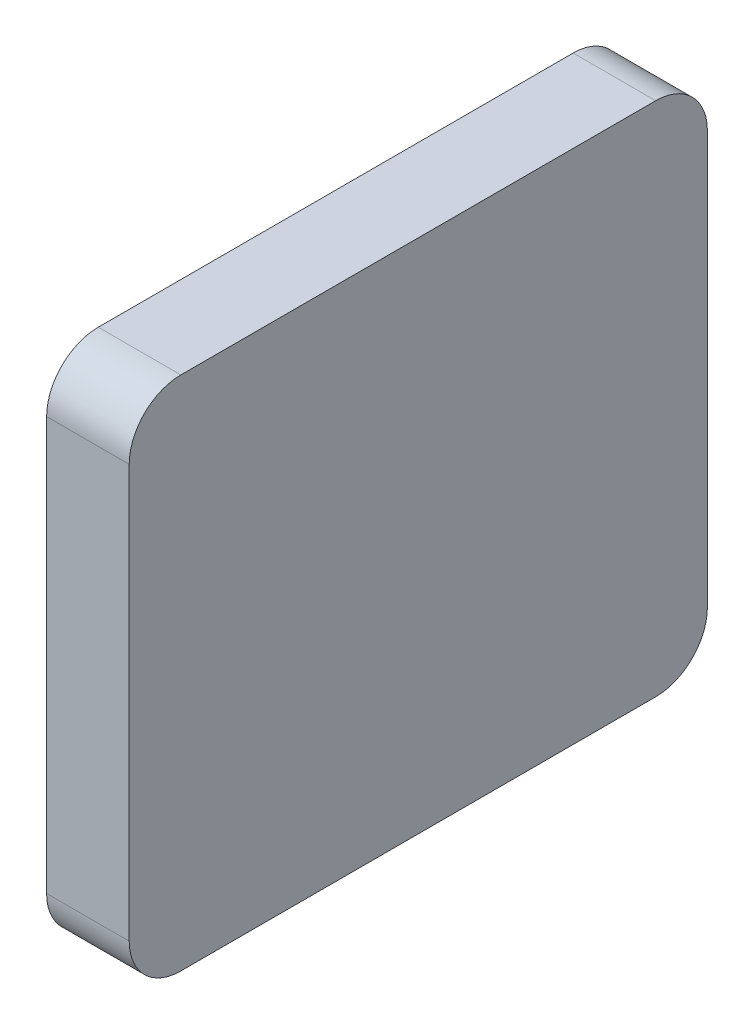
ISO-10303-21;
HEADER;
FILE_DESCRIPTION(('STEP AP214'),'2;1');
FILE_NAME('part.step','',(''),(''),'','','');
FILE_SCHEMA(('AUTOMOTIVE_DESIGN { 1 0 10303 214 1 1 1 1 }'));
ENDSEC;
DATA;
#1=APPLICATION_CONTEXT('core data for automotive mechanical design processes');
#2=APPLICATION_PROTOCOL_DEFINITION('international standard','automotive_design',2000,#1);
#3=PRODUCT_CONTEXT('',#1,'mechanical');
#4=PRODUCT('Part','Part','',(#3));
#5=PRODUCT_RELATED_PRODUCT_CATEGORY('part','',(#4));
#6=PRODUCT_DEFINITION_FORMATION('','',#4);
#7=PRODUCT_DEFINITION_CONTEXT('part definition',#1,'design');
#8=PRODUCT_DEFINITION('design','',#6,#7);
#9=PRODUCT_DEFINITION_SHAPE('','',#8);
#10=(LENGTH_UNIT() NAMED_UNIT(*) SI_UNIT(.MILLI.,.METRE.));
#11=(NAMED_UNIT(*) PLANE_ANGLE_UNIT() SI_UNIT($,.RADIAN.));
#12=(NAMED_UNIT(*) SI_UNIT($,.STERADIAN.) SOLID_ANGLE_UNIT());
#13=UNCERTAINTY_MEASURE_WITH_UNIT(LENGTH_MEASURE(1.E-05),#10,'distance_accuracy_value','');
#14=(GEOMETRIC_REPRESENTATION_CONTEXT(3) GLOBAL_UNCERTAINTY_ASSIGNED_CONTEXT((#13)) GLOBAL_UNIT_ASSIGNED_CONTEXT((#10,
#11,#12)) REPRESENTATION_CONTEXT('',''));
#15=CARTESIAN_POINT('',(0.,0.,0.));
#16=DIRECTION('',(0.,0.,1.));
#17=DIRECTION('',(1.,0.,0.));
#18=AXIS2_PLACEMENT_3D('',#15,#16,#17);
#19=CARTESIAN_POINT('',(0.4,2.5,-2.8));
#20=DIRECTION('',(0.,0.,1.));
#21=DIRECTION('',(0.,-1.,0.));
#22=AXIS2_PLACEMENT_3D('',#19,#20,#21);
#23=PLANE('',#22);
#24=DIRECTION('',(0.,1.,0.));
#25=VECTOR('',#24,1.);
#26=CARTESIAN_POINT('',(0.4,2.5,-2.8));
#27=LINE('',#26,#25);
#28=CARTESIAN_POINT('',(0.4,-2.,-2.8));
#29=VERTEX_POINT('',#28);
#30=CARTESIAN_POINT('',(0.4,2.,-2.8));
#31=VERTEX_POINT('',#30);
#32=EDGE_CURVE('E118',#29,#31,#27,.T.);
#33=ORIENTED_EDGE('',*,*,#32,.F.);
#34=DIRECTION('',(-1.,0.,0.));
#35=VECTOR('',#34,1.);
#36=CARTESIAN_POINT('',(0.4,-2.,-2.8));
#37=LINE('',#36,#35);
#38=CARTESIAN_POINT('',(-0.4,-2.,-2.8));
#39=VERTEX_POINT('',#38);
#40=EDGE_CURVE('E103',#29,#39,#37,.T.);
#41=ORIENTED_EDGE('',*,*,#40,.T.);
#42=DIRECTION('',(0.,1.,0.));
#43=VECTOR('',#42,1.);
#44=CARTESIAN_POINT('',(-0.4,2.5,-2.8));
#45=LINE('',#44,#43);
#46=CARTESIAN_POINT('',(-0.4,2.,-2.8));
#47=VERTEX_POINT('',#46);
#48=EDGE_CURVE('E115',#39,#47,#45,.T.);
#49=ORIENTED_EDGE('',*,*,#48,.T.);
#50=DIRECTION('',(-1.,0.,0.));
#51=VECTOR('',#50,1.);
#52=CARTESIAN_POINT('',(0.4,2.,-2.8));
#53=LINE('',#52,#51);
#54=EDGE_CURVE('E120',#47,#31,#53,.F.);
#55=ORIENTED_EDGE('',*,*,#54,.T.);
#56=EDGE_LOOP('',(#33,#41,#49,#55));
#57=FACE_BOUND('',#56,.T.);
#58=ADVANCED_FACE('F33',(#57),#23,.F.);
#59=CARTESIAN_POINT('',(0.4,2.5,2.8));
#60=DIRECTION('',(0.,-1.,0.));
#61=DIRECTION('',(0.,0.,-1.));
#62=AXIS2_PLACEMENT_3D('',#59,#60,#61);
#63=PLANE('',#62);
#64=DIRECTION('',(0.,0.,1.));
#65=VECTOR('',#64,1.);
#66=CARTESIAN_POINT('',(-0.4,2.5,2.8));
#67=LINE('',#66,#65);
#68=CARTESIAN_POINT('',(-0.4,2.5,-2.3));
#69=VERTEX_POINT('',#68);
#70=CARTESIAN_POINT('',(-0.4,2.5,2.3));
#71=VERTEX_POINT('',#70);
#72=EDGE_CURVE('E124',#69,#71,#67,.T.);
#73=ORIENTED_EDGE('',*,*,#72,.T.);
#74=DIRECTION('',(-1.,0.,0.));
#75=VECTOR('',#74,1.);
#76=CARTESIAN_POINT('',(0.4,2.5,2.3));
#77=LINE('',#76,#75);
#78=CARTESIAN_POINT('',(0.4,2.5,2.3));
#79=VERTEX_POINT('',#78);
#80=EDGE_CURVE('E11',#71,#79,#77,.F.);
#81=ORIENTED_EDGE('',*,*,#80,.T.);
#82=DIRECTION('',(0.,0.,1.));
#83=VECTOR('',#82,1.);
#84=CARTESIAN_POINT('',(0.4,2.5,2.8));
#85=LINE('',#84,#83);
#86=CARTESIAN_POINT('',(0.4,2.5,-2.3));
#87=VERTEX_POINT('',#86);
#88=EDGE_CURVE('E160',#87,#79,#85,.T.);
#89=ORIENTED_EDGE('',*,*,#88,.F.);
#90=DIRECTION('',(-1.,0.,0.));
#91=VECTOR('',#90,1.);
#92=CARTESIAN_POINT('',(0.4,2.5,-2.3));
#93=LINE('',#92,#91);
#94=EDGE_CURVE('E41',#87,#69,#93,.T.);
#95=ORIENTED_EDGE('',*,*,#94,.T.);
#96=EDGE_LOOP('',(#73,#81,#89,#95));
#97=FACE_BOUND('',#96,.T.);
#98=ADVANCED_FACE('F158',(#97),#63,.F.);
#99=CARTESIAN_POINT('',(0.4,2.5,2.8));
#100=DIRECTION('',(0.,0.,-1.));
#101=DIRECTION('',(0.,1.,0.));
#102=AXIS2_PLACEMENT_3D('',#99,#100,#101);
#103=PLANE('',#102);
#104=DIRECTION('',(0.,-1.,0.));
#105=VECTOR('',#104,1.);
#106=CARTESIAN_POINT('',(-0.4,2.5,2.8));
#107=LINE('',#106,#105);
#108=CARTESIAN_POINT('',(-0.4,2.,2.8));
#109=VERTEX_POINT('',#108);
#110=CARTESIAN_POINT('',(-0.4,-2.,2.8));
#111=VERTEX_POINT('',#110);
#112=EDGE_CURVE('E127',#109,#111,#107,.T.);
#113=ORIENTED_EDGE('',*,*,#112,.T.);
#114=DIRECTION('',(-1.,0.,0.));
#115=VECTOR('',#114,1.);
#116=CARTESIAN_POINT('',(0.4,-2.,2.8));
#117=LINE('',#116,#115);
#118=CARTESIAN_POINT('',(0.4,-2.,2.8));
#119=VERTEX_POINT('',#118);
#120=EDGE_CURVE('E48',#111,#119,#117,.F.);
#121=ORIENTED_EDGE('',*,*,#120,.T.);
#122=DIRECTION('',(0.,-1.,0.));
#123=VECTOR('',#122,1.);
#124=CARTESIAN_POINT('',(0.4,2.5,2.8));
#125=LINE('',#124,#123);
#126=CARTESIAN_POINT('',(0.4,2.,2.8));
#127=VERTEX_POINT('',#126);
#128=EDGE_CURVE('E168',#127,#119,#125,.T.);
#129=ORIENTED_EDGE('',*,*,#128,.F.);
#130=DIRECTION('',(-1.,0.,0.));
#131=VECTOR('',#130,1.);
#132=CARTESIAN_POINT('',(0.4,2.,2.8));
#133=LINE('',#132,#131);
#134=EDGE_CURVE('E151',#127,#109,#133,.T.);
#135=ORIENTED_EDGE('',*,*,#134,.T.);
#136=EDGE_LOOP('',(#113,#121,#129,#135));
#137=FACE_BOUND('',#136,.T.);
#138=ADVANCED_FACE('F167',(#137),#103,.F.);
#139=CARTESIAN_POINT('',(0.4,-2.5,2.8));
#140=DIRECTION('',(0.,1.,0.));
#141=DIRECTION('',(0.,0.,1.));
#142=AXIS2_PLACEMENT_3D('',#139,#140,#141);
#143=PLANE('',#142);
#144=DIRECTION('',(0.,0.,-1.));
#145=VECTOR('',#144,1.);
#146=CARTESIAN_POINT('',(-0.4,-2.5,2.8));
#147=LINE('',#146,#145);
#148=CARTESIAN_POINT('',(-0.4,-2.5,2.3));
#149=VERTEX_POINT('',#148);
#150=CARTESIAN_POINT('',(-0.4,-2.5,-2.3));
#151=VERTEX_POINT('',#150);
#152=EDGE_CURVE('E134',#149,#151,#147,.T.);
#153=ORIENTED_EDGE('',*,*,#152,.T.);
#154=DIRECTION('',(-1.,0.,0.));
#155=VECTOR('',#154,1.);
#156=CARTESIAN_POINT('',(0.4,-2.5,-2.3));
#157=LINE('',#156,#155);
#158=CARTESIAN_POINT('',(0.4,-2.5,-2.3));
#159=VERTEX_POINT('',#158);
#160=EDGE_CURVE('E104',#151,#159,#157,.F.);
#161=ORIENTED_EDGE('',*,*,#160,.T.);
#162=DIRECTION('',(0.,0.,-1.));
#163=VECTOR('',#162,1.);
#164=CARTESIAN_POINT('',(0.4,-2.5,2.8));
#165=LINE('',#164,#163);
#166=CARTESIAN_POINT('',(0.4,-2.5,2.3));
#167=VERTEX_POINT('',#166);
#168=EDGE_CURVE('E130',#167,#159,#165,.T.);
#169=ORIENTED_EDGE('',*,*,#168,.F.);
#170=DIRECTION('',(-1.,0.,0.));
#171=VECTOR('',#170,1.);
#172=CARTESIAN_POINT('',(0.4,-2.5,2.3));
#173=LINE('',#172,#171);
#174=EDGE_CURVE('E109',#167,#149,#173,.T.);
#175=ORIENTED_EDGE('',*,*,#174,.T.);
#176=EDGE_LOOP('',(#153,#161,#169,#175));
#177=FACE_BOUND('',#176,.T.);
#178=ADVANCED_FACE('F196',(#177),#143,.F.);
#179=CARTESIAN_POINT('',(0.4,0.,0.));
#180=DIRECTION('',(1.,0.,0.));
#181=DIRECTION('',(0.,0.,-1.));
#182=AXIS2_PLACEMENT_3D('',#179,#180,#181);
#183=PLANE('',#182);
#184=ORIENTED_EDGE('',*,*,#168,.T.);
#185=CARTESIAN_POINT('',(0.4,-2.,-2.3));
#186=DIRECTION('',(1.,0.,0.));
#187=DIRECTION('',(0.,0.,-1.));
#188=AXIS2_PLACEMENT_3D('',#185,#186,#187);
#189=CIRCLE('',#188,0.5);
#190=EDGE_CURVE('E149',#159,#29,#189,.T.);
#191=ORIENTED_EDGE('',*,*,#190,.T.);
#192=ORIENTED_EDGE('',*,*,#32,.T.);
#193=CARTESIAN_POINT('',(0.4,2.,-2.3));
#194=DIRECTION('',(1.,0.,0.));
#195=DIRECTION('',(0.,0.,-1.));
#196=AXIS2_PLACEMENT_3D('',#193,#194,#195);
#197=CIRCLE('',#196,0.5);
#198=EDGE_CURVE('E144',#31,#87,#197,.T.);
#199=ORIENTED_EDGE('',*,*,#198,.T.);
#200=ORIENTED_EDGE('',*,*,#88,.T.);
#201=CARTESIAN_POINT('',(0.4,2.,2.3));
#202=DIRECTION('',(1.,0.,0.));
#203=DIRECTION('',(0.,0.,-1.));
#204=AXIS2_PLACEMENT_3D('',#201,#202,#203);
#205=CIRCLE('',#204,0.5);
#206=EDGE_CURVE('E55',#79,#127,#205,.T.);
#207=ORIENTED_EDGE('',*,*,#206,.T.);
#208=ORIENTED_EDGE('',*,*,#128,.T.);
#209=CARTESIAN_POINT('',(0.4,-2.,2.3));
#210=DIRECTION('',(1.,0.,0.));
#211=DIRECTION('',(0.,0.,-1.));
#212=AXIS2_PLACEMENT_3D('',#209,#210,#211);
#213=CIRCLE('',#212,0.5);
#214=EDGE_CURVE('E147',#119,#167,#213,.T.);
#215=ORIENTED_EDGE('',*,*,#214,.T.);
#216=EDGE_LOOP('',(#184,#191,#192,#199,#200,#207,#208,#215));
#217=FACE_BOUND('',#216,.T.);
#218=ADVANCED_FACE('F173',(#217),#183,.T.);
#219=CARTESIAN_POINT('',(-0.4,0.,0.));
#220=DIRECTION('',(1.,0.,0.));
#221=DIRECTION('',(0.,0.,-1.));
#222=AXIS2_PLACEMENT_3D('',#219,#220,#221);
#223=PLANE('',#222);
#224=ORIENTED_EDGE('',*,*,#48,.F.);
#225=CARTESIAN_POINT('',(-0.4,-2.,-2.3));
#226=DIRECTION('',(1.,0.,0.));
#227=DIRECTION('',(0.,0.,-1.));
#228=AXIS2_PLACEMENT_3D('',#225,#226,#227);
#229=CIRCLE('',#228,0.5);
#230=EDGE_CURVE('E99',#39,#151,#229,.F.);
#231=ORIENTED_EDGE('',*,*,#230,.T.);
#232=ORIENTED_EDGE('',*,*,#152,.F.);
#233=CARTESIAN_POINT('',(-0.4,-2.,2.3));
#234=DIRECTION('',(1.,0.,0.));
#235=DIRECTION('',(0.,0.,-1.));
#236=AXIS2_PLACEMENT_3D('',#233,#234,#235);
#237=CIRCLE('',#236,0.5);
#238=EDGE_CURVE('E110',#149,#111,#237,.F.);
#239=ORIENTED_EDGE('',*,*,#238,.T.);
#240=ORIENTED_EDGE('',*,*,#112,.F.);
#241=CARTESIAN_POINT('',(-0.4,2.,2.3));
#242=DIRECTION('',(1.,0.,0.));
#243=DIRECTION('',(0.,0.,-1.));
#244=AXIS2_PLACEMENT_3D('',#241,#242,#243);
#245=CIRCLE('',#244,0.5);
#246=EDGE_CURVE('E138',#109,#71,#245,.F.);
#247=ORIENTED_EDGE('',*,*,#246,.T.);
#248=ORIENTED_EDGE('',*,*,#72,.F.);
#249=CARTESIAN_POINT('',(-0.4,2.,-2.3));
#250=DIRECTION('',(1.,0.,0.));
#251=DIRECTION('',(0.,0.,-1.));
#252=AXIS2_PLACEMENT_3D('',#249,#250,#251);
#253=CIRCLE('',#252,0.5);
#254=EDGE_CURVE('E119',#69,#47,#253,.F.);
#255=ORIENTED_EDGE('',*,*,#254,.T.);
#256=EDGE_LOOP('',(#224,#231,#232,#239,#240,#247,#248,#255));
#257=FACE_BOUND('',#256,.T.);
#258=ADVANCED_FACE('F122',(#257),#223,.F.);
#259=CARTESIAN_POINT('',(0.4,-2.,-2.3));
#260=DIRECTION('',(-1.,0.,0.));
#261=DIRECTION('',(0.,0.,1.));
#262=AXIS2_PLACEMENT_3D('',#259,#260,#261);
#263=CYLINDRICAL_SURFACE('',#262,0.5);
#264=ORIENTED_EDGE('',*,*,#190,.F.);
#265=ORIENTED_EDGE('',*,*,#160,.F.);
#266=ORIENTED_EDGE('',*,*,#230,.F.);
#267=ORIENTED_EDGE('',*,*,#40,.F.);
#268=EDGE_LOOP('',(#264,#265,#266,#267));
#269=FACE_BOUND('',#268,.T.);
#270=ADVANCED_FACE('F102',(#269),#263,.T.);
#271=CARTESIAN_POINT('',(0.4,-2.,2.3));
#272=DIRECTION('',(-1.,0.,0.));
#273=DIRECTION('',(0.,0.,1.));
#274=AXIS2_PLACEMENT_3D('',#271,#272,#273);
#275=CYLINDRICAL_SURFACE('',#274,0.5);
#276=ORIENTED_EDGE('',*,*,#214,.F.);
#277=ORIENTED_EDGE('',*,*,#120,.F.);
#278=ORIENTED_EDGE('',*,*,#238,.F.);
#279=ORIENTED_EDGE('',*,*,#174,.F.);
#280=EDGE_LOOP('',(#276,#277,#278,#279));
#281=FACE_BOUND('',#280,.T.);
#282=ADVANCED_FACE('F178',(#281),#275,.T.);
#283=CARTESIAN_POINT('',(0.4,2.,2.3));
#284=DIRECTION('',(-1.,0.,0.));
#285=DIRECTION('',(0.,0.,1.));
#286=AXIS2_PLACEMENT_3D('',#283,#284,#285);
#287=CYLINDRICAL_SURFACE('',#286,0.5);
#288=ORIENTED_EDGE('',*,*,#206,.F.);
#289=ORIENTED_EDGE('',*,*,#80,.F.);
#290=ORIENTED_EDGE('',*,*,#246,.F.);
#291=ORIENTED_EDGE('',*,*,#134,.F.);
#292=EDGE_LOOP('',(#288,#289,#290,#291));
#293=FACE_BOUND('',#292,.T.);
#294=ADVANCED_FACE('F166',(#293),#287,.T.);
#295=CARTESIAN_POINT('',(0.4,2.,-2.3));
#296=DIRECTION('',(-1.,0.,0.));
#297=DIRECTION('',(0.,0.,1.));
#298=AXIS2_PLACEMENT_3D('',#295,#296,#297);
#299=CYLINDRICAL_SURFACE('',#298,0.5);
#300=ORIENTED_EDGE('',*,*,#198,.F.);
#301=ORIENTED_EDGE('',*,*,#54,.F.);
#302=ORIENTED_EDGE('',*,*,#254,.F.);
#303=ORIENTED_EDGE('',*,*,#94,.F.);
#304=EDGE_LOOP('',(#300,#301,#302,#303));
#305=FACE_BOUND('',#304,.T.);
#306=ADVANCED_FACE('F35',(#305),#299,.T.);
#307=CLOSED_SHELL('',(#58,#98,#138,#178,#218,#258,#270,#282,#294,#306));
#308=MANIFOLD_SOLID_BREP('B2',#307);
#309=ADVANCED_BREP_SHAPE_REPRESENTATION('',(#18,#308),#14);
#310=SHAPE_DEFINITION_REPRESENTATION(#9,#309);
ENDSEC;
END-ISO-10303-21;
